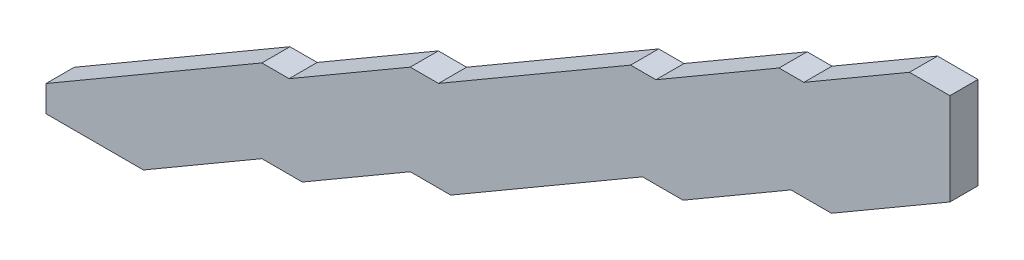
ISO-10303-21;
HEADER;
FILE_DESCRIPTION(('STEP AP214'),'2;1');
FILE_NAME('part.step','',(''),(''),'','','');
FILE_SCHEMA(('AUTOMOTIVE_DESIGN { 1 0 10303 214 1 1 1 1 }'));
ENDSEC;
DATA;
#1=APPLICATION_CONTEXT('core data for automotive mechanical design processes');
#2=APPLICATION_PROTOCOL_DEFINITION('international standard','automotive_design',2000,#1);
#3=PRODUCT_CONTEXT('',#1,'mechanical');
#4=PRODUCT('Part','Part','',(#3));
#5=PRODUCT_RELATED_PRODUCT_CATEGORY('part','',(#4));
#6=PRODUCT_DEFINITION_FORMATION('','',#4);
#7=PRODUCT_DEFINITION_CONTEXT('part definition',#1,'design');
#8=PRODUCT_DEFINITION('design','',#6,#7);
#9=PRODUCT_DEFINITION_SHAPE('','',#8);
#10=(LENGTH_UNIT() NAMED_UNIT(*) SI_UNIT(.MILLI.,.METRE.));
#11=(NAMED_UNIT(*) PLANE_ANGLE_UNIT() SI_UNIT($,.RADIAN.));
#12=(NAMED_UNIT(*) SI_UNIT($,.STERADIAN.) SOLID_ANGLE_UNIT());
#13=UNCERTAINTY_MEASURE_WITH_UNIT(LENGTH_MEASURE(1.E-05),#10,'distance_accuracy_value','');
#14=(GEOMETRIC_REPRESENTATION_CONTEXT(3) GLOBAL_UNCERTAINTY_ASSIGNED_CONTEXT((#13)) GLOBAL_UNIT_ASSIGNED_CONTEXT((#10,
#11,#12)) REPRESENTATION_CONTEXT('',''));
#15=CARTESIAN_POINT('',(0.,0.,0.));
#16=DIRECTION('',(0.,0.,1.));
#17=DIRECTION('',(1.,0.,0.));
#18=AXIS2_PLACEMENT_3D('',#15,#16,#17);
#19=CARTESIAN_POINT('',(4751.37508524931,2862.20635570422,167.6675));
#20=DIRECTION('',(1.,0.,0.));
#21=DIRECTION('',(0.,0.,-1.));
#22=AXIS2_PLACEMENT_3D('',#19,#20,#21);
#23=PLANE('',#22);
#24=DIRECTION('',(0.,-1.,0.));
#25=VECTOR('',#24,1.);
#26=CARTESIAN_POINT('',(4751.37508524931,2862.20635570422,-167.3325));
#27=LINE('',#26,#25);
#28=CARTESIAN_POINT('',(4751.37508524931,2862.20635570422,-167.3325));
#29=VERTEX_POINT('',#28);
#30=CARTESIAN_POINT('',(4751.37508524931,1763.73672125713,-167.3325));
#31=VERTEX_POINT('',#30);
#32=EDGE_CURVE('E125',#29,#31,#27,.T.);
#33=ORIENTED_EDGE('',*,*,#32,.F.);
#34=DIRECTION('',(0.,0.,-1.));
#35=VECTOR('',#34,1.);
#36=CARTESIAN_POINT('',(4751.37508524931,2862.20635570422,167.6675));
#37=LINE('',#36,#35);
#38=CARTESIAN_POINT('',(4751.37508524931,2862.20635570422,167.6675));
#39=VERTEX_POINT('',#38);
#40=EDGE_CURVE('E11',#39,#29,#37,.T.);
#41=ORIENTED_EDGE('',*,*,#40,.F.);
#42=DIRECTION('',(0.,1.,0.));
#43=VECTOR('',#42,1.);
#44=CARTESIAN_POINT('',(4751.37508524931,1763.73672125713,167.6675));
#45=LINE('',#44,#43);
#46=CARTESIAN_POINT('',(4751.37508524931,1763.73672125713,167.6675));
#47=VERTEX_POINT('',#46);
#48=EDGE_CURVE('E132',#47,#39,#45,.T.);
#49=ORIENTED_EDGE('',*,*,#48,.F.);
#50=DIRECTION('',(0.,0.,-1.));
#51=VECTOR('',#50,1.);
#52=CARTESIAN_POINT('',(4751.37508524931,1763.73672125713,167.6675));
#53=LINE('',#52,#51);
#54=EDGE_CURVE('E50',#47,#31,#53,.T.);
#55=ORIENTED_EDGE('',*,*,#54,.T.);
#56=EDGE_LOOP('',(#33,#41,#49,#55));
#57=FACE_BOUND('',#56,.T.);
#58=ADVANCED_FACE('F34',(#57),#23,.T.);
#59=CARTESIAN_POINT('',(4268.59219593317,2862.20635570422,167.6675));
#60=DIRECTION('',(0.,1.,0.));
#61=DIRECTION('',(0.,0.,1.));
#62=AXIS2_PLACEMENT_3D('',#59,#60,#61);
#63=PLANE('',#62);
#64=DIRECTION('',(1.,0.,0.));
#65=VECTOR('',#64,1.);
#66=CARTESIAN_POINT('',(4268.59219593317,2862.20635570422,-167.3325));
#67=LINE('',#66,#65);
#68=CARTESIAN_POINT('',(4268.59219593317,2862.20635570422,-167.3325));
#69=VERTEX_POINT('',#68);
#70=EDGE_CURVE('E217',#69,#29,#67,.T.);
#71=ORIENTED_EDGE('',*,*,#70,.F.);
#72=DIRECTION('',(0.,0.,-1.));
#73=VECTOR('',#72,1.);
#74=CARTESIAN_POINT('',(4268.59219593317,2862.20635570422,167.6675));
#75=LINE('',#74,#73);
#76=CARTESIAN_POINT('',(4268.59219593317,2862.20635570422,167.6675));
#77=VERTEX_POINT('',#76);
#78=EDGE_CURVE('E42',#77,#69,#75,.T.);
#79=ORIENTED_EDGE('',*,*,#78,.F.);
#80=DIRECTION('',(1.,0.,0.));
#81=VECTOR('',#80,1.);
#82=CARTESIAN_POINT('',(4268.59219593317,2862.20635570422,167.6675));
#83=LINE('',#82,#81);
#84=EDGE_CURVE('E331',#77,#39,#83,.T.);
#85=ORIENTED_EDGE('',*,*,#84,.T.);
#86=ORIENTED_EDGE('',*,*,#40,.T.);
#87=EDGE_LOOP('',(#71,#79,#85,#86));
#88=FACE_BOUND('',#87,.T.);
#89=ADVANCED_FACE('F320',(#88),#63,.T.);
#90=CARTESIAN_POINT('',(3009.81637534942,2128.89391366494,167.6675));
#91=DIRECTION('',(-0.503372377918512,0.864069585825507,0.));
#92=DIRECTION('',(-0.864069585825507,-0.503372377918512,0.));
#93=AXIS2_PLACEMENT_3D('',#90,#91,#92);
#94=PLANE('',#93);
#95=DIRECTION('',(0.864069585825507,0.503372377918512,0.));
#96=VECTOR('',#95,1.);
#97=CARTESIAN_POINT('',(3009.81637534942,2128.89391366494,-167.3325));
#98=LINE('',#97,#96);
#99=CARTESIAN_POINT('',(3009.81637534942,2128.89391366494,-167.3325));
#100=VERTEX_POINT('',#99);
#101=EDGE_CURVE('E219',#100,#69,#98,.T.);
#102=ORIENTED_EDGE('',*,*,#101,.F.);
#103=DIRECTION('',(0.,0.,-1.));
#104=VECTOR('',#103,1.);
#105=CARTESIAN_POINT('',(3009.81637534942,2128.89391366494,167.6675));
#106=LINE('',#105,#104);
#107=CARTESIAN_POINT('',(3009.81637534942,2128.89391366494,167.6675));
#108=VERTEX_POINT('',#107);
#109=EDGE_CURVE('E310',#108,#100,#106,.T.);
#110=ORIENTED_EDGE('',*,*,#109,.F.);
#111=DIRECTION('',(0.864069585825507,0.503372377918512,0.));
#112=VECTOR('',#111,1.);
#113=CARTESIAN_POINT('',(3009.81637534942,2128.89391366494,167.6675));
#114=LINE('',#113,#112);
#115=EDGE_CURVE('E317',#108,#77,#114,.T.);
#116=ORIENTED_EDGE('',*,*,#115,.T.);
#117=ORIENTED_EDGE('',*,*,#78,.T.);
#118=EDGE_LOOP('',(#102,#110,#116,#117));
#119=FACE_BOUND('',#118,.T.);
#120=ADVANCED_FACE('F315',(#119),#94,.T.);
#121=CARTESIAN_POINT('',(2712.95844147015,2128.89391366495,167.6675));
#122=DIRECTION('',(0.,1.,0.));
#123=DIRECTION('',(-1.,0.,0.));
#124=AXIS2_PLACEMENT_3D('',#121,#122,#123);
#125=PLANE('',#124);
#126=DIRECTION('',(1.,0.,0.));
#127=VECTOR('',#126,1.);
#128=CARTESIAN_POINT('',(2712.95844147015,2128.89391366495,-167.3325));
#129=LINE('',#128,#127);
#130=CARTESIAN_POINT('',(2712.95844147015,2128.89391366495,-167.3325));
#131=VERTEX_POINT('',#130);
#132=EDGE_CURVE('E222',#131,#100,#129,.T.);
#133=ORIENTED_EDGE('',*,*,#132,.F.);
#134=DIRECTION('',(0.,0.,-1.));
#135=VECTOR('',#134,1.);
#136=CARTESIAN_POINT('',(2712.95844147015,2128.89391366495,167.6675));
#137=LINE('',#136,#135);
#138=CARTESIAN_POINT('',(2712.95844147015,2128.89391366495,167.6675));
#139=VERTEX_POINT('',#138);
#140=EDGE_CURVE('E308',#139,#131,#137,.T.);
#141=ORIENTED_EDGE('',*,*,#140,.F.);
#142=DIRECTION('',(1.,0.,0.));
#143=VECTOR('',#142,1.);
#144=CARTESIAN_POINT('',(2712.95844147015,2128.89391366495,167.6675));
#145=LINE('',#144,#143);
#146=EDGE_CURVE('E328',#139,#108,#145,.T.);
#147=ORIENTED_EDGE('',*,*,#146,.T.);
#148=ORIENTED_EDGE('',*,*,#109,.T.);
#149=EDGE_LOOP('',(#133,#141,#147,#148));
#150=FACE_BOUND('',#149,.T.);
#151=ADVANCED_FACE('F325',(#150),#125,.T.);
#152=CARTESIAN_POINT('',(1244.78781170484,1273.59643158886,167.6675));
#153=DIRECTION('',(-0.50337237791851,0.864069585825508,0.));
#154=DIRECTION('',(-0.864069585825508,-0.50337237791851,0.));
#155=AXIS2_PLACEMENT_3D('',#152,#153,#154);
#156=PLANE('',#155);
#157=DIRECTION('',(0.864069585825508,0.50337237791851,0.));
#158=VECTOR('',#157,1.);
#159=CARTESIAN_POINT('',(1244.78781170484,1273.59643158886,-167.3325));
#160=LINE('',#159,#158);
#161=CARTESIAN_POINT('',(1244.78781170484,1273.59643158886,-167.3325));
#162=VERTEX_POINT('',#161);
#163=EDGE_CURVE('E225',#162,#131,#160,.T.);
#164=ORIENTED_EDGE('',*,*,#163,.F.);
#165=DIRECTION('',(0.,0.,-1.));
#166=VECTOR('',#165,1.);
#167=CARTESIAN_POINT('',(1244.78781170484,1273.59643158886,167.6675));
#168=LINE('',#167,#166);
#169=CARTESIAN_POINT('',(1244.78781170484,1273.59643158886,167.6675));
#170=VERTEX_POINT('',#169);
#171=EDGE_CURVE('E306',#170,#162,#168,.T.);
#172=ORIENTED_EDGE('',*,*,#171,.F.);
#173=DIRECTION('',(0.864069585825508,0.50337237791851,0.));
#174=VECTOR('',#173,1.);
#175=CARTESIAN_POINT('',(1244.78781170484,1273.59643158886,167.6675));
#176=LINE('',#175,#174);
#177=EDGE_CURVE('E333',#170,#139,#176,.T.);
#178=ORIENTED_EDGE('',*,*,#177,.T.);
#179=ORIENTED_EDGE('',*,*,#140,.T.);
#180=EDGE_LOOP('',(#164,#172,#178,#179));
#181=FACE_BOUND('',#180,.T.);
#182=ADVANCED_FACE('F402',(#181),#156,.T.);
#183=CARTESIAN_POINT('',(942.754513977767,1273.59643158886,167.6675));
#184=DIRECTION('',(0.,1.,0.));
#185=DIRECTION('',(0.,0.,1.));
#186=AXIS2_PLACEMENT_3D('',#183,#184,#185);
#187=PLANE('',#186);
#188=DIRECTION('',(1.,0.,0.));
#189=VECTOR('',#188,1.);
#190=CARTESIAN_POINT('',(942.754513977767,1273.59643158886,-167.3325));
#191=LINE('',#190,#189);
#192=CARTESIAN_POINT('',(942.754513977767,1273.59643158886,-167.3325));
#193=VERTEX_POINT('',#192);
#194=EDGE_CURVE('E228',#193,#162,#191,.T.);
#195=ORIENTED_EDGE('',*,*,#194,.F.);
#196=DIRECTION('',(0.,0.,-1.));
#197=VECTOR('',#196,1.);
#198=CARTESIAN_POINT('',(942.754513977767,1273.59643158886,167.6675));
#199=LINE('',#198,#197);
#200=CARTESIAN_POINT('',(942.754513977767,1273.59643158886,167.6675));
#201=VERTEX_POINT('',#200);
#202=EDGE_CURVE('E304',#201,#193,#199,.T.);
#203=ORIENTED_EDGE('',*,*,#202,.F.);
#204=DIRECTION('',(1.,0.,0.));
#205=VECTOR('',#204,1.);
#206=CARTESIAN_POINT('',(942.754513977767,1273.59643158886,167.6675));
#207=LINE('',#206,#205);
#208=EDGE_CURVE('E339',#201,#170,#207,.T.);
#209=ORIENTED_EDGE('',*,*,#208,.T.);
#210=ORIENTED_EDGE('',*,*,#171,.T.);
#211=EDGE_LOOP('',(#195,#203,#209,#210));
#212=FACE_BOUND('',#211,.T.);
#213=ADVANCED_FACE('F405',(#212),#187,.T.);
#214=CARTESIAN_POINT('',(-1348.83937024249,-61.3945016025019,167.6675));
#215=DIRECTION('',(-0.503372377918511,0.864069585825507,0.));
#216=DIRECTION('',(-0.864069585825507,-0.503372377918511,0.));
#217=AXIS2_PLACEMENT_3D('',#214,#215,#216);
#218=PLANE('',#217);
#219=DIRECTION('',(0.864069585825507,0.503372377918511,0.));
#220=VECTOR('',#219,1.);
#221=CARTESIAN_POINT('',(-1348.83937024249,-61.3945016025019,-167.3325));
#222=LINE('',#221,#220);
#223=CARTESIAN_POINT('',(-1348.83937024249,-61.3945016025019,-167.3325));
#224=VERTEX_POINT('',#223);
#225=EDGE_CURVE('E231',#224,#193,#222,.T.);
#226=ORIENTED_EDGE('',*,*,#225,.F.);
#227=DIRECTION('',(0.,0.,-1.));
#228=VECTOR('',#227,1.);
#229=CARTESIAN_POINT('',(-1348.83937024249,-61.3945016025019,167.6675));
#230=LINE('',#229,#228);
#231=CARTESIAN_POINT('',(-1348.83937024249,-61.3945016025019,167.6675));
#232=VERTEX_POINT('',#231);
#233=EDGE_CURVE('E302',#232,#224,#230,.T.);
#234=ORIENTED_EDGE('',*,*,#233,.F.);
#235=DIRECTION('',(0.864069585825507,0.503372377918511,0.));
#236=VECTOR('',#235,1.);
#237=CARTESIAN_POINT('',(-1348.83937024249,-61.3945016025019,167.6675));
#238=LINE('',#237,#236);
#239=EDGE_CURVE('E342',#232,#201,#238,.T.);
#240=ORIENTED_EDGE('',*,*,#239,.T.);
#241=ORIENTED_EDGE('',*,*,#202,.T.);
#242=EDGE_LOOP('',(#226,#234,#240,#241));
#243=FACE_BOUND('',#242,.T.);
#244=ADVANCED_FACE('F409',(#243),#218,.T.);
#245=CARTESIAN_POINT('',(-1685.73010563211,-61.3945016025019,167.6675));
#246=DIRECTION('',(0.,1.,0.));
#247=DIRECTION('',(0.,0.,1.));
#248=AXIS2_PLACEMENT_3D('',#245,#246,#247);
#249=PLANE('',#248);
#250=DIRECTION('',(1.,0.,0.));
#251=VECTOR('',#250,1.);
#252=CARTESIAN_POINT('',(-1685.73010563211,-61.3945016025019,-167.3325));
#253=LINE('',#252,#251);
#254=CARTESIAN_POINT('',(-1685.73010563211,-61.3945016025019,-167.3325));
#255=VERTEX_POINT('',#254);
#256=EDGE_CURVE('E234',#255,#224,#253,.T.);
#257=ORIENTED_EDGE('',*,*,#256,.F.);
#258=DIRECTION('',(0.,0.,-1.));
#259=VECTOR('',#258,1.);
#260=CARTESIAN_POINT('',(-1685.73010563211,-61.3945016025019,167.6675));
#261=LINE('',#260,#259);
#262=CARTESIAN_POINT('',(-1685.73010563211,-61.3945016025019,167.6675));
#263=VERTEX_POINT('',#262);
#264=EDGE_CURVE('E300',#263,#255,#261,.T.);
#265=ORIENTED_EDGE('',*,*,#264,.F.);
#266=DIRECTION('',(1.,0.,0.));
#267=VECTOR('',#266,1.);
#268=CARTESIAN_POINT('',(-1685.73010563211,-61.3945016025019,167.6675));
#269=LINE('',#268,#267);
#270=EDGE_CURVE('E345',#263,#232,#269,.T.);
#271=ORIENTED_EDGE('',*,*,#270,.T.);
#272=ORIENTED_EDGE('',*,*,#233,.T.);
#273=EDGE_LOOP('',(#257,#265,#271,#272));
#274=FACE_BOUND('',#273,.T.);
#275=ADVANCED_FACE('F413',(#274),#249,.T.);
#276=CARTESIAN_POINT('',(-3130.89393289329,-903.28914081178,167.6675));
#277=DIRECTION('',(-0.503372377918512,0.864069585825507,0.));
#278=DIRECTION('',(-0.864069585825507,-0.503372377918512,0.));
#279=AXIS2_PLACEMENT_3D('',#276,#277,#278);
#280=PLANE('',#279);
#281=DIRECTION('',(0.864069585825507,0.503372377918512,0.));
#282=VECTOR('',#281,1.);
#283=CARTESIAN_POINT('',(-3130.89393289329,-903.28914081178,-167.3325));
#284=LINE('',#283,#282);
#285=CARTESIAN_POINT('',(-3130.89393289329,-903.28914081178,-167.3325));
#286=VERTEX_POINT('',#285);
#287=EDGE_CURVE('E237',#286,#255,#284,.T.);
#288=ORIENTED_EDGE('',*,*,#287,.F.);
#289=DIRECTION('',(0.,0.,-1.));
#290=VECTOR('',#289,1.);
#291=CARTESIAN_POINT('',(-3130.89393289329,-903.28914081178,167.6675));
#292=LINE('',#291,#290);
#293=CARTESIAN_POINT('',(-3130.89393289329,-903.28914081178,167.6675));
#294=VERTEX_POINT('',#293);
#295=EDGE_CURVE('E298',#294,#286,#292,.T.);
#296=ORIENTED_EDGE('',*,*,#295,.F.);
#297=DIRECTION('',(0.864069585825507,0.503372377918512,0.));
#298=VECTOR('',#297,1.);
#299=CARTESIAN_POINT('',(-3130.89393289329,-903.28914081178,167.6675));
#300=LINE('',#299,#298);
#301=EDGE_CURVE('E348',#294,#263,#300,.T.);
#302=ORIENTED_EDGE('',*,*,#301,.T.);
#303=ORIENTED_EDGE('',*,*,#264,.T.);
#304=EDGE_LOOP('',(#288,#296,#302,#303));
#305=FACE_BOUND('',#304,.T.);
#306=ADVANCED_FACE('F417',(#305),#280,.T.);
#307=CARTESIAN_POINT('',(-3455.93403312458,-903.28914081178,167.6675));
#308=DIRECTION('',(0.,1.,0.));
#309=DIRECTION('',(0.,0.,1.));
#310=AXIS2_PLACEMENT_3D('',#307,#308,#309);
#311=PLANE('',#310);
#312=DIRECTION('',(1.,0.,0.));
#313=VECTOR('',#312,1.);
#314=CARTESIAN_POINT('',(-3455.93403312458,-903.28914081178,-167.3325));
#315=LINE('',#314,#313);
#316=CARTESIAN_POINT('',(-3455.93403312458,-903.28914081178,-167.3325));
#317=VERTEX_POINT('',#316);
#318=EDGE_CURVE('E240',#317,#286,#315,.T.);
#319=ORIENTED_EDGE('',*,*,#318,.F.);
#320=DIRECTION('',(0.,0.,-1.));
#321=VECTOR('',#320,1.);
#322=CARTESIAN_POINT('',(-3455.93403312458,-903.28914081178,167.6675));
#323=LINE('',#322,#321);
#324=CARTESIAN_POINT('',(-3455.93403312458,-903.28914081178,167.6675));
#325=VERTEX_POINT('',#324);
#326=EDGE_CURVE('E296',#325,#317,#323,.T.);
#327=ORIENTED_EDGE('',*,*,#326,.F.);
#328=DIRECTION('',(1.,0.,0.));
#329=VECTOR('',#328,1.);
#330=CARTESIAN_POINT('',(-3455.93403312458,-903.28914081178,167.6675));
#331=LINE('',#330,#329);
#332=EDGE_CURVE('E351',#325,#294,#331,.T.);
#333=ORIENTED_EDGE('',*,*,#332,.T.);
#334=ORIENTED_EDGE('',*,*,#295,.T.);
#335=EDGE_LOOP('',(#319,#327,#333,#334));
#336=FACE_BOUND('',#335,.T.);
#337=ADVANCED_FACE('F421',(#336),#311,.T.);
#338=CARTESIAN_POINT('',(-6030.77610947716,-2403.28914081175,167.6675));
#339=DIRECTION('',(-0.503372377918511,0.864069585825507,0.));
#340=DIRECTION('',(-0.864069585825507,-0.503372377918511,0.));
#341=AXIS2_PLACEMENT_3D('',#338,#339,#340);
#342=PLANE('',#341);
#343=DIRECTION('',(0.864069585825507,0.503372377918511,0.));
#344=VECTOR('',#343,1.);
#345=CARTESIAN_POINT('',(-6030.77610947716,-2403.28914081175,-167.3325));
#346=LINE('',#345,#344);
#347=CARTESIAN_POINT('',(-6030.77610947716,-2403.28914081175,-167.3325));
#348=VERTEX_POINT('',#347);
#349=EDGE_CURVE('E243',#348,#317,#346,.T.);
#350=ORIENTED_EDGE('',*,*,#349,.F.);
#351=DIRECTION('',(0.,0.,-1.));
#352=VECTOR('',#351,1.);
#353=CARTESIAN_POINT('',(-6030.77610947716,-2403.28914081175,167.6675));
#354=LINE('',#353,#352);
#355=CARTESIAN_POINT('',(-6030.77610947716,-2403.28914081175,167.6675));
#356=VERTEX_POINT('',#355);
#357=EDGE_CURVE('E293',#356,#348,#354,.T.);
#358=ORIENTED_EDGE('',*,*,#357,.F.);
#359=DIRECTION('',(0.864069585825507,0.503372377918511,0.));
#360=VECTOR('',#359,1.);
#361=CARTESIAN_POINT('',(-6030.77610947716,-2403.28914081175,167.6675));
#362=LINE('',#361,#360);
#363=EDGE_CURVE('E354',#356,#325,#362,.T.);
#364=ORIENTED_EDGE('',*,*,#363,.T.);
#365=ORIENTED_EDGE('',*,*,#326,.T.);
#366=EDGE_LOOP('',(#350,#358,#364,#365));
#367=FACE_BOUND('',#366,.T.);
#368=ADVANCED_FACE('F425',(#367),#342,.T.);
#369=CARTESIAN_POINT('',(-6030.77610947716,-2653.28914081175,167.6675));
#370=DIRECTION('',(1.,0.,0.));
#371=DIRECTION('',(0.,0.,-1.));
#372=AXIS2_PLACEMENT_3D('',#369,#370,#371);
#373=PLANE('',#372);
#374=DIRECTION('',(0.,-1.,0.));
#375=VECTOR('',#374,1.);
#376=CARTESIAN_POINT('',(-6030.77610947716,-2653.28914081175,-167.3325));
#377=LINE('',#376,#375);
#378=CARTESIAN_POINT('',(-6030.77610947716,-2715.78914081175,-167.3325));
#379=VERTEX_POINT('',#378);
#380=EDGE_CURVE('E246',#348,#379,#377,.T.);
#381=ORIENTED_EDGE('',*,*,#380,.T.);
#382=DIRECTION('',(0.,0.,-1.));
#383=VECTOR('',#382,1.);
#384=CARTESIAN_POINT('',(-6030.77610947716,-2715.78914081175,167.6675));
#385=LINE('',#384,#383);
#386=CARTESIAN_POINT('',(-6030.77610947716,-2715.78914081175,167.6675));
#387=VERTEX_POINT('',#386);
#388=EDGE_CURVE('E290',#387,#379,#385,.T.);
#389=ORIENTED_EDGE('',*,*,#388,.F.);
#390=DIRECTION('',(0.,1.,0.));
#391=VECTOR('',#390,1.);
#392=CARTESIAN_POINT('',(-6030.77610947716,-2653.28914081175,167.6675));
#393=LINE('',#392,#391);
#394=EDGE_CURVE('E357',#387,#356,#393,.T.);
#395=ORIENTED_EDGE('',*,*,#394,.T.);
#396=ORIENTED_EDGE('',*,*,#357,.T.);
#397=EDGE_LOOP('',(#381,#389,#395,#396));
#398=FACE_BOUND('',#397,.T.);
#399=ADVANCED_FACE('F429',(#398),#373,.F.);
#400=CARTESIAN_POINT('',(-5539.07606625301,-2715.78914081175,167.6675));
#401=DIRECTION('',(0.,1.,0.));
#402=DIRECTION('',(0.,0.,1.));
#403=AXIS2_PLACEMENT_3D('',#400,#401,#402);
#404=PLANE('',#403);
#405=DIRECTION('',(1.,0.,0.));
#406=VECTOR('',#405,1.);
#407=CARTESIAN_POINT('',(-5539.07606625301,-2715.78914081175,-167.3325));
#408=LINE('',#407,#406);
#409=CARTESIAN_POINT('',(-4869.13758652499,-2715.78914081175,-167.3325));
#410=VERTEX_POINT('',#409);
#411=EDGE_CURVE('E249',#379,#410,#408,.T.);
#412=ORIENTED_EDGE('',*,*,#411,.T.);
#413=DIRECTION('',(0.,0.,-1.));
#414=VECTOR('',#413,1.);
#415=CARTESIAN_POINT('',(-4869.13758652499,-2715.78914081175,167.6675));
#416=LINE('',#415,#414);
#417=CARTESIAN_POINT('',(-4869.13758652499,-2715.78914081175,167.6675));
#418=VERTEX_POINT('',#417);
#419=EDGE_CURVE('E288',#418,#410,#416,.T.);
#420=ORIENTED_EDGE('',*,*,#419,.F.);
#421=DIRECTION('',(1.,0.,0.));
#422=VECTOR('',#421,1.);
#423=CARTESIAN_POINT('',(-6030.77610947716,-2715.78914081175,167.6675));
#424=LINE('',#423,#422);
#425=EDGE_CURVE('E360',#387,#418,#424,.T.);
#426=ORIENTED_EDGE('',*,*,#425,.F.);
#427=ORIENTED_EDGE('',*,*,#388,.T.);
#428=EDGE_LOOP('',(#412,#420,#426,#427));
#429=FACE_BOUND('',#428,.T.);
#430=ADVANCED_FACE('F433',(#429),#404,.F.);
#431=CARTESIAN_POINT('',(-3455.93403312458,-1892.5132787428,167.6675));
#432=DIRECTION('',(0.503372377918511,-0.864069585825507,0.));
#433=DIRECTION('',(0.864069585825507,0.503372377918511,0.));
#434=AXIS2_PLACEMENT_3D('',#431,#432,#433);
#435=PLANE('',#434);
#436=DIRECTION('',(-0.864069585825507,-0.503372377918511,0.));
#437=VECTOR('',#436,1.);
#438=CARTESIAN_POINT('',(-3455.93403312458,-1892.5132787428,-167.3325));
#439=LINE('',#438,#437);
#440=CARTESIAN_POINT('',(-3455.93403312458,-1892.5132787428,-167.3325));
#441=VERTEX_POINT('',#440);
#442=EDGE_CURVE('E252',#441,#410,#439,.T.);
#443=ORIENTED_EDGE('',*,*,#442,.F.);
#444=DIRECTION('',(0.,0.,-1.));
#445=VECTOR('',#444,1.);
#446=CARTESIAN_POINT('',(-3455.93403312458,-1892.5132787428,167.6675));
#447=LINE('',#446,#445);
#448=CARTESIAN_POINT('',(-3455.93403312458,-1892.5132787428,167.6675));
#449=VERTEX_POINT('',#448);
#450=EDGE_CURVE('E286',#449,#441,#447,.T.);
#451=ORIENTED_EDGE('',*,*,#450,.F.);
#452=DIRECTION('',(-0.864069585825507,-0.503372377918511,0.));
#453=VECTOR('',#452,1.);
#454=CARTESIAN_POINT('',(-3455.93403312458,-1892.5132787428,167.6675));
#455=LINE('',#454,#453);
#456=EDGE_CURVE('E362',#449,#418,#455,.T.);
#457=ORIENTED_EDGE('',*,*,#456,.T.);
#458=ORIENTED_EDGE('',*,*,#419,.T.);
#459=EDGE_LOOP('',(#443,#451,#457,#458));
#460=FACE_BOUND('',#459,.T.);
#461=ADVANCED_FACE('F437',(#460),#435,.T.);
#462=CARTESIAN_POINT('',(-2973.15114380847,-1892.5132787428,167.6675));
#463=DIRECTION('',(0.,-1.,0.));
#464=DIRECTION('',(0.,0.,-1.));
#465=AXIS2_PLACEMENT_3D('',#462,#463,#464);
#466=PLANE('',#465);
#467=DIRECTION('',(-1.,0.,0.));
#468=VECTOR('',#467,1.);
#469=CARTESIAN_POINT('',(-2973.15114380847,-1892.5132787428,-167.3325));
#470=LINE('',#469,#468);
#471=CARTESIAN_POINT('',(-2973.15114380847,-1892.5132787428,-167.3325));
#472=VERTEX_POINT('',#471);
#473=EDGE_CURVE('E255',#472,#441,#470,.T.);
#474=ORIENTED_EDGE('',*,*,#473,.F.);
#475=DIRECTION('',(0.,0.,-1.));
#476=VECTOR('',#475,1.);
#477=CARTESIAN_POINT('',(-2973.15114380847,-1892.5132787428,167.6675));
#478=LINE('',#477,#476);
#479=CARTESIAN_POINT('',(-2973.15114380847,-1892.5132787428,167.6675));
#480=VERTEX_POINT('',#479);
#481=EDGE_CURVE('E284',#480,#472,#478,.T.);
#482=ORIENTED_EDGE('',*,*,#481,.F.);
#483=DIRECTION('',(-1.,0.,0.));
#484=VECTOR('',#483,1.);
#485=CARTESIAN_POINT('',(-2973.15114380847,-1892.5132787428,167.6675));
#486=LINE('',#485,#484);
#487=EDGE_CURVE('E365',#480,#449,#486,.T.);
#488=ORIENTED_EDGE('',*,*,#487,.T.);
#489=ORIENTED_EDGE('',*,*,#450,.T.);
#490=EDGE_LOOP('',(#474,#482,#488,#489));
#491=FACE_BOUND('',#490,.T.);
#492=ADVANCED_FACE('F441',(#491),#466,.T.);
#493=CARTESIAN_POINT('',(-1685.73010563219,-1142.51327874283,167.6675));
#494=DIRECTION('',(0.503372377918512,-0.864069585825507,0.));
#495=DIRECTION('',(0.864069585825507,0.503372377918512,0.));
#496=AXIS2_PLACEMENT_3D('',#493,#494,#495);
#497=PLANE('',#496);
#498=DIRECTION('',(-0.864069585825507,-0.503372377918512,0.));
#499=VECTOR('',#498,1.);
#500=CARTESIAN_POINT('',(-1685.73010563219,-1142.51327874283,-167.3325));
#501=LINE('',#500,#499);
#502=CARTESIAN_POINT('',(-1685.73010563219,-1142.51327874283,-167.3325));
#503=VERTEX_POINT('',#502);
#504=EDGE_CURVE('E258',#503,#472,#501,.T.);
#505=ORIENTED_EDGE('',*,*,#504,.F.);
#506=DIRECTION('',(0.,0.,-1.));
#507=VECTOR('',#506,1.);
#508=CARTESIAN_POINT('',(-1685.73010563219,-1142.51327874283,167.6675));
#509=LINE('',#508,#507);
#510=CARTESIAN_POINT('',(-1685.73010563219,-1142.51327874283,167.6675));
#511=VERTEX_POINT('',#510);
#512=EDGE_CURVE('E282',#511,#503,#509,.T.);
#513=ORIENTED_EDGE('',*,*,#512,.F.);
#514=DIRECTION('',(-0.864069585825507,-0.503372377918512,0.));
#515=VECTOR('',#514,1.);
#516=CARTESIAN_POINT('',(-1685.73010563219,-1142.51327874283,167.6675));
#517=LINE('',#516,#515);
#518=EDGE_CURVE('E368',#511,#480,#517,.T.);
#519=ORIENTED_EDGE('',*,*,#518,.T.);
#520=ORIENTED_EDGE('',*,*,#481,.T.);
#521=EDGE_LOOP('',(#505,#513,#519,#520));
#522=FACE_BOUND('',#521,.T.);
#523=ADVANCED_FACE('F445',(#522),#497,.T.);
#524=CARTESIAN_POINT('',(-1202.94721631606,-1142.51327874283,167.6675));
#525=DIRECTION('',(0.,-1.,0.));
#526=DIRECTION('',(0.,0.,-1.));
#527=AXIS2_PLACEMENT_3D('',#524,#525,#526);
#528=PLANE('',#527);
#529=DIRECTION('',(-1.,0.,0.));
#530=VECTOR('',#529,1.);
#531=CARTESIAN_POINT('',(-1202.94721631606,-1142.51327874283,-167.3325));
#532=LINE('',#531,#530);
#533=CARTESIAN_POINT('',(-1202.94721631606,-1142.51327874283,-167.3325));
#534=VERTEX_POINT('',#533);
#535=EDGE_CURVE('E261',#534,#503,#532,.T.);
#536=ORIENTED_EDGE('',*,*,#535,.F.);
#537=DIRECTION('',(0.,0.,-1.));
#538=VECTOR('',#537,1.);
#539=CARTESIAN_POINT('',(-1202.94721631606,-1142.51327874283,167.6675));
#540=LINE('',#539,#538);
#541=CARTESIAN_POINT('',(-1202.94721631606,-1142.51327874283,167.6675));
#542=VERTEX_POINT('',#541);
#543=EDGE_CURVE('E280',#542,#534,#540,.T.);
#544=ORIENTED_EDGE('',*,*,#543,.F.);
#545=DIRECTION('',(-1.,0.,0.));
#546=VECTOR('',#545,1.);
#547=CARTESIAN_POINT('',(-1202.94721631606,-1142.51327874283,167.6675));
#548=LINE('',#547,#546);
#549=EDGE_CURVE('E371',#542,#511,#548,.T.);
#550=ORIENTED_EDGE('',*,*,#549,.T.);
#551=ORIENTED_EDGE('',*,*,#512,.T.);
#552=EDGE_LOOP('',(#536,#544,#550,#551));
#553=FACE_BOUND('',#552,.T.);
#554=ADVANCED_FACE('F449',(#553),#528,.T.);
#555=CARTESIAN_POINT('',(1085.10573744736,190.414850001597,167.6675));
#556=DIRECTION('',(0.503372377918511,-0.864069585825508,0.));
#557=DIRECTION('',(0.864069585825508,0.503372377918511,0.));
#558=AXIS2_PLACEMENT_3D('',#555,#556,#557);
#559=PLANE('',#558);
#560=DIRECTION('',(-0.864069585825508,-0.503372377918511,0.));
#561=VECTOR('',#560,1.);
#562=CARTESIAN_POINT('',(1085.10573744736,190.414850001597,-167.3325));
#563=LINE('',#562,#561);
#564=CARTESIAN_POINT('',(1085.10573744736,190.414850001597,-167.3325));
#565=VERTEX_POINT('',#564);
#566=EDGE_CURVE('E264',#565,#534,#563,.T.);
#567=ORIENTED_EDGE('',*,*,#566,.F.);
#568=DIRECTION('',(0.,0.,-1.));
#569=VECTOR('',#568,1.);
#570=CARTESIAN_POINT('',(1085.10573744736,190.414850001597,167.6675));
#571=LINE('',#570,#569);
#572=CARTESIAN_POINT('',(1085.10573744736,190.414850001597,167.6675));
#573=VERTEX_POINT('',#572);
#574=EDGE_CURVE('E278',#573,#565,#571,.T.);
#575=ORIENTED_EDGE('',*,*,#574,.F.);
#576=DIRECTION('',(-0.864069585825508,-0.503372377918511,0.));
#577=VECTOR('',#576,1.);
#578=CARTESIAN_POINT('',(1085.10573744736,190.414850001597,167.6675));
#579=LINE('',#578,#577);
#580=EDGE_CURVE('E374',#573,#542,#579,.T.);
#581=ORIENTED_EDGE('',*,*,#580,.T.);
#582=ORIENTED_EDGE('',*,*,#543,.T.);
#583=EDGE_LOOP('',(#567,#575,#581,#582));
#584=FACE_BOUND('',#583,.T.);
#585=ADVANCED_FACE('F453',(#584),#559,.T.);
#586=CARTESIAN_POINT('',(1567.88862676346,190.41485000159,167.6675));
#587=DIRECTION('',(0.,-1.,0.));
#588=DIRECTION('',(1.,0.,0.));
#589=AXIS2_PLACEMENT_3D('',#586,#587,#588);
#590=PLANE('',#589);
#591=DIRECTION('',(-1.,0.,0.));
#592=VECTOR('',#591,1.);
#593=CARTESIAN_POINT('',(1567.88862676346,190.41485000159,-167.3325));
#594=LINE('',#593,#592);
#595=CARTESIAN_POINT('',(1567.88862676346,190.41485000159,-167.3325));
#596=VERTEX_POINT('',#595);
#597=EDGE_CURVE('E267',#596,#565,#594,.T.);
#598=ORIENTED_EDGE('',*,*,#597,.F.);
#599=DIRECTION('',(0.,0.,-1.));
#600=VECTOR('',#599,1.);
#601=CARTESIAN_POINT('',(1567.88862676346,190.41485000159,167.6675));
#602=LINE('',#601,#600);
#603=CARTESIAN_POINT('',(1567.88862676346,190.41485000159,167.6675));
#604=VERTEX_POINT('',#603);
#605=EDGE_CURVE('E200',#604,#596,#602,.T.);
#606=ORIENTED_EDGE('',*,*,#605,.F.);
#607=DIRECTION('',(-1.,0.,0.));
#608=VECTOR('',#607,1.);
#609=CARTESIAN_POINT('',(1567.88862676346,190.41485000159,167.6675));
#610=LINE('',#609,#608);
#611=EDGE_CURVE('E208',#604,#573,#610,.T.);
#612=ORIENTED_EDGE('',*,*,#611,.T.);
#613=ORIENTED_EDGE('',*,*,#574,.T.);
#614=EDGE_LOOP('',(#598,#606,#612,#613));
#615=FACE_BOUND('',#614,.T.);
#616=ADVANCED_FACE('F378',(#615),#590,.T.);
#617=CARTESIAN_POINT('',(2855.30966493977,940.414850001584,167.6675));
#618=DIRECTION('',(0.503372377918511,-0.864069585825507,0.));
#619=DIRECTION('',(0.864069585825507,0.503372377918511,0.));
#620=AXIS2_PLACEMENT_3D('',#617,#618,#619);
#621=PLANE('',#620);
#622=DIRECTION('',(-0.864069585825507,-0.503372377918511,0.));
#623=VECTOR('',#622,1.);
#624=CARTESIAN_POINT('',(2855.30966493977,940.414850001584,-167.3325));
#625=LINE('',#624,#623);
#626=CARTESIAN_POINT('',(2855.30966493977,940.414850001584,-167.3325));
#627=VERTEX_POINT('',#626);
#628=EDGE_CURVE('E196',#627,#596,#625,.T.);
#629=ORIENTED_EDGE('',*,*,#628,.F.);
#630=DIRECTION('',(0.,0.,-1.));
#631=VECTOR('',#630,1.);
#632=CARTESIAN_POINT('',(2855.30966493977,940.414850001584,167.6675));
#633=LINE('',#632,#631);
#634=CARTESIAN_POINT('',(2855.30966493977,940.414850001584,167.6675));
#635=VERTEX_POINT('',#634);
#636=EDGE_CURVE('E191',#635,#627,#633,.T.);
#637=ORIENTED_EDGE('',*,*,#636,.F.);
#638=DIRECTION('',(-0.864069585825507,-0.503372377918511,0.));
#639=VECTOR('',#638,1.);
#640=CARTESIAN_POINT('',(2855.30966493977,940.414850001584,167.6675));
#641=LINE('',#640,#639);
#642=EDGE_CURVE('E194',#635,#604,#641,.T.);
#643=ORIENTED_EDGE('',*,*,#642,.T.);
#644=ORIENTED_EDGE('',*,*,#605,.T.);
#645=EDGE_LOOP('',(#629,#637,#643,#644));
#646=FACE_BOUND('',#645,.T.);
#647=ADVANCED_FACE('F193',(#646),#621,.T.);
#648=CARTESIAN_POINT('',(3338.09255425591,940.414850001563,167.6675));
#649=DIRECTION('',(0.,-1.,0.));
#650=DIRECTION('',(1.,0.,0.));
#651=AXIS2_PLACEMENT_3D('',#648,#649,#650);
#652=PLANE('',#651);
#653=DIRECTION('',(-1.,0.,0.));
#654=VECTOR('',#653,1.);
#655=CARTESIAN_POINT('',(3338.09255425591,940.414850001563,-167.3325));
#656=LINE('',#655,#654);
#657=CARTESIAN_POINT('',(3338.09255425591,940.414850001563,-167.3325));
#658=VERTEX_POINT('',#657);
#659=EDGE_CURVE('E271',#658,#627,#656,.T.);
#660=ORIENTED_EDGE('',*,*,#659,.F.);
#661=DIRECTION('',(0.,0.,-1.));
#662=VECTOR('',#661,1.);
#663=CARTESIAN_POINT('',(3338.09255425591,940.414850001563,167.6675));
#664=LINE('',#663,#662);
#665=CARTESIAN_POINT('',(3338.09255425591,940.414850001563,167.6675));
#666=VERTEX_POINT('',#665);
#667=EDGE_CURVE('E117',#666,#658,#664,.T.);
#668=ORIENTED_EDGE('',*,*,#667,.F.);
#669=DIRECTION('',(-1.,0.,0.));
#670=VECTOR('',#669,1.);
#671=CARTESIAN_POINT('',(3338.09255425591,940.414850001563,167.6675));
#672=LINE('',#671,#670);
#673=EDGE_CURVE('E205',#666,#635,#672,.T.);
#674=ORIENTED_EDGE('',*,*,#673,.T.);
#675=ORIENTED_EDGE('',*,*,#636,.T.);
#676=EDGE_LOOP('',(#660,#668,#674,#675));
#677=FACE_BOUND('',#676,.T.);
#678=ADVANCED_FACE('F210',(#677),#652,.T.);
#679=CARTESIAN_POINT('',(4751.37508524931,1763.73672125713,167.6675));
#680=DIRECTION('',(0.503372377918529,-0.864069585825497,0.));
#681=DIRECTION('',(0.864069585825497,0.503372377918529,0.));
#682=AXIS2_PLACEMENT_3D('',#679,#680,#681);
#683=PLANE('',#682);
#684=DIRECTION('',(-0.864069585825497,-0.503372377918529,0.));
#685=VECTOR('',#684,1.);
#686=CARTESIAN_POINT('',(4751.37508524931,1763.73672125713,-167.3325));
#687=LINE('',#686,#685);
#688=EDGE_CURVE('E273',#31,#658,#687,.T.);
#689=ORIENTED_EDGE('',*,*,#688,.F.);
#690=ORIENTED_EDGE('',*,*,#54,.F.);
#691=DIRECTION('',(-0.864069585825497,-0.503372377918529,0.));
#692=VECTOR('',#691,1.);
#693=CARTESIAN_POINT('',(4751.37508524931,1763.73672125713,167.6675));
#694=LINE('',#693,#692);
#695=EDGE_CURVE('E211',#47,#666,#694,.T.);
#696=ORIENTED_EDGE('',*,*,#695,.T.);
#697=ORIENTED_EDGE('',*,*,#667,.T.);
#698=EDGE_LOOP('',(#689,#690,#696,#697));
#699=FACE_BOUND('',#698,.T.);
#700=ADVANCED_FACE('F380',(#699),#683,.T.);
#701=CARTESIAN_POINT('',(150605.236719737,-60648.7381525791,167.6675));
#702=DIRECTION('',(0.,0.,-1.));
#703=DIRECTION('',(-1.,0.,0.));
#704=AXIS2_PLACEMENT_3D('',#701,#702,#703);
#705=PLANE('',#704);
#706=ORIENTED_EDGE('',*,*,#48,.T.);
#707=ORIENTED_EDGE('',*,*,#84,.F.);
#708=ORIENTED_EDGE('',*,*,#115,.F.);
#709=ORIENTED_EDGE('',*,*,#146,.F.);
#710=ORIENTED_EDGE('',*,*,#177,.F.);
#711=ORIENTED_EDGE('',*,*,#208,.F.);
#712=ORIENTED_EDGE('',*,*,#239,.F.);
#713=ORIENTED_EDGE('',*,*,#270,.F.);
#714=ORIENTED_EDGE('',*,*,#301,.F.);
#715=ORIENTED_EDGE('',*,*,#332,.F.);
#716=ORIENTED_EDGE('',*,*,#363,.F.);
#717=ORIENTED_EDGE('',*,*,#394,.F.);
#718=ORIENTED_EDGE('',*,*,#425,.T.);
#719=ORIENTED_EDGE('',*,*,#456,.F.);
#720=ORIENTED_EDGE('',*,*,#487,.F.);
#721=ORIENTED_EDGE('',*,*,#518,.F.);
#722=ORIENTED_EDGE('',*,*,#549,.F.);
#723=ORIENTED_EDGE('',*,*,#580,.F.);
#724=ORIENTED_EDGE('',*,*,#611,.F.);
#725=ORIENTED_EDGE('',*,*,#642,.F.);
#726=ORIENTED_EDGE('',*,*,#673,.F.);
#727=ORIENTED_EDGE('',*,*,#695,.F.);
#728=EDGE_LOOP('',(#706,#707,#708,#709,#710,#711,#712,#713,#714,#715,#716,#717,#718,#719,#720,
#721,#722,#723,#724,#725,#726,#727));
#729=FACE_BOUND('',#728,.T.);
#730=ADVANCED_FACE('F204',(#729),#705,.F.);
#731=CARTESIAN_POINT('',(150605.236719737,-60648.7381525791,-167.3325));
#732=DIRECTION('',(0.,0.,-1.));
#733=DIRECTION('',(-1.,0.,0.));
#734=AXIS2_PLACEMENT_3D('',#731,#732,#733);
#735=PLANE('',#734);
#736=ORIENTED_EDGE('',*,*,#32,.T.);
#737=ORIENTED_EDGE('',*,*,#688,.T.);
#738=ORIENTED_EDGE('',*,*,#659,.T.);
#739=ORIENTED_EDGE('',*,*,#628,.T.);
#740=ORIENTED_EDGE('',*,*,#597,.T.);
#741=ORIENTED_EDGE('',*,*,#566,.T.);
#742=ORIENTED_EDGE('',*,*,#535,.T.);
#743=ORIENTED_EDGE('',*,*,#504,.T.);
#744=ORIENTED_EDGE('',*,*,#473,.T.);
#745=ORIENTED_EDGE('',*,*,#442,.T.);
#746=ORIENTED_EDGE('',*,*,#411,.F.);
#747=ORIENTED_EDGE('',*,*,#380,.F.);
#748=ORIENTED_EDGE('',*,*,#349,.T.);
#749=ORIENTED_EDGE('',*,*,#318,.T.);
#750=ORIENTED_EDGE('',*,*,#287,.T.);
#751=ORIENTED_EDGE('',*,*,#256,.T.);
#752=ORIENTED_EDGE('',*,*,#225,.T.);
#753=ORIENTED_EDGE('',*,*,#194,.T.);
#754=ORIENTED_EDGE('',*,*,#163,.T.);
#755=ORIENTED_EDGE('',*,*,#132,.T.);
#756=ORIENTED_EDGE('',*,*,#101,.T.);
#757=ORIENTED_EDGE('',*,*,#70,.T.);
#758=EDGE_LOOP('',(#736,#737,#738,#739,#740,#741,#742,#743,#744,#745,#746,#747,#748,#749,#750,
#751,#752,#753,#754,#755,#756,#757));
#759=FACE_BOUND('',#758,.T.);
#760=ADVANCED_FACE('F321',(#759),#735,.T.);
#761=CLOSED_SHELL('',(#58,#89,#120,#151,#182,#213,#244,#275,#306,#337,#368,#399,#430,#461,#492,
#523,#554,#585,#616,#647,#678,#700,#730,#760));
#762=MANIFOLD_SOLID_BREP('B2',#761);
#763=ADVANCED_BREP_SHAPE_REPRESENTATION('',(#18,#762),#14);
#764=SHAPE_DEFINITION_REPRESENTATION(#9,#763);
ENDSEC;
END-ISO-10303-21;
